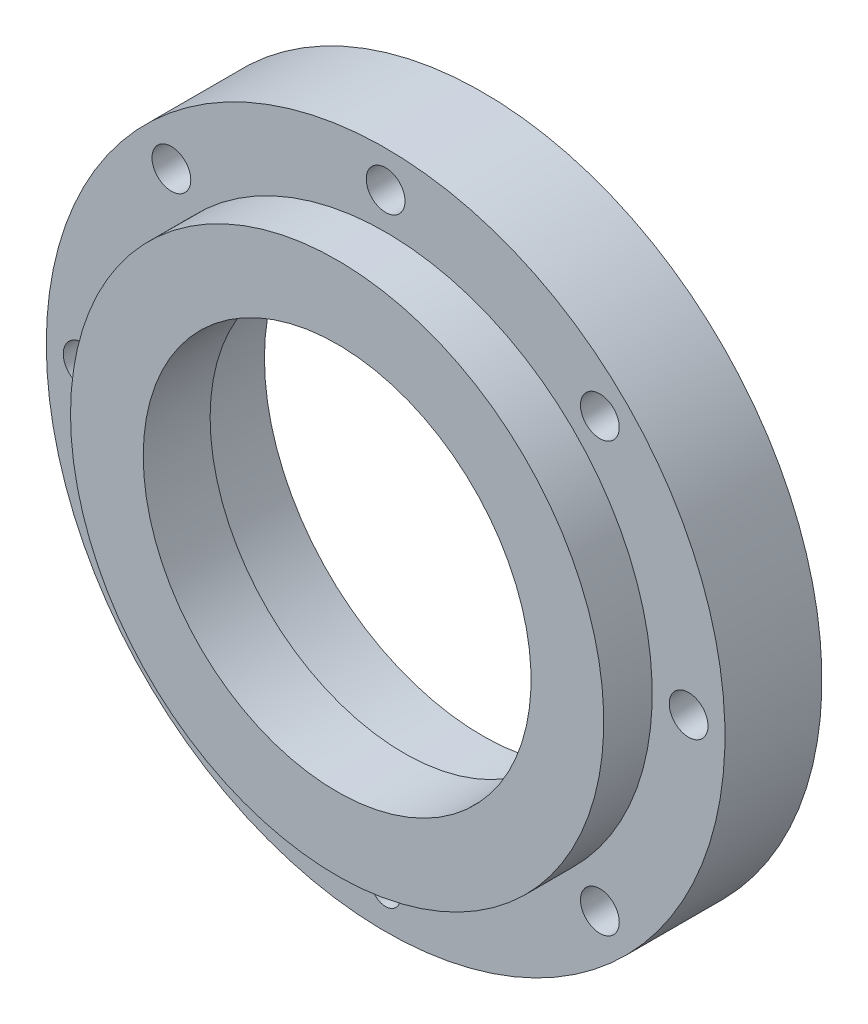
ISO-10303-21;
HEADER;
FILE_DESCRIPTION(('STEP AP214'),'2;1');
FILE_NAME('part.step','',(''),(''),'','','');
FILE_SCHEMA(('AUTOMOTIVE_DESIGN { 1 0 10303 214 1 1 1 1 }'));
ENDSEC;
DATA;
#1=APPLICATION_CONTEXT('core data for automotive mechanical design processes');
#2=APPLICATION_PROTOCOL_DEFINITION('international standard','automotive_design',2000,#1);
#3=PRODUCT_CONTEXT('',#1,'mechanical');
#4=PRODUCT('Part','Part','',(#3));
#5=PRODUCT_RELATED_PRODUCT_CATEGORY('part','',(#4));
#6=PRODUCT_DEFINITION_FORMATION('','',#4);
#7=PRODUCT_DEFINITION_CONTEXT('part definition',#1,'design');
#8=PRODUCT_DEFINITION('design','',#6,#7);
#9=PRODUCT_DEFINITION_SHAPE('','',#8);
#10=(LENGTH_UNIT() NAMED_UNIT(*) SI_UNIT(.MILLI.,.METRE.));
#11=(NAMED_UNIT(*) PLANE_ANGLE_UNIT() SI_UNIT($,.RADIAN.));
#12=(NAMED_UNIT(*) SI_UNIT($,.STERADIAN.) SOLID_ANGLE_UNIT());
#13=UNCERTAINTY_MEASURE_WITH_UNIT(LENGTH_MEASURE(1.E-05),#10,'distance_accuracy_value','');
#14=(GEOMETRIC_REPRESENTATION_CONTEXT(3) GLOBAL_UNCERTAINTY_ASSIGNED_CONTEXT((#13)) GLOBAL_UNIT_ASSIGNED_CONTEXT((#10,
#11,#12)) REPRESENTATION_CONTEXT('',''));
#15=CARTESIAN_POINT('',(0.,0.,0.));
#16=DIRECTION('',(0.,0.,1.));
#17=DIRECTION('',(1.,0.,0.));
#18=AXIS2_PLACEMENT_3D('',#15,#16,#17);
#19=CARTESIAN_POINT('',(-45.,0.,-10.2042412100189));
#20=DIRECTION('',(0.,0.,-1.));
#21=DIRECTION('',(-1.,0.,0.));
#22=AXIS2_PLACEMENT_3D('',#19,#20,#21);
#23=PLANE('',#22);
#24=CARTESIAN_POINT('',(44.194173824159,44.1941738241595,-10.2042412100189));
#25=DIRECTION('',(0.,0.,1.));
#26=DIRECTION('',(1.,0.,0.));
#27=AXIS2_PLACEMENT_3D('',#24,#25,#26);
#28=CIRCLE('',#27,4.);
#29=CARTESIAN_POINT('',(48.194173824159,44.1941738241595,-10.2042412100189));
#30=VERTEX_POINT('',#29);
#31=EDGE_CURVE('E139',#30,#30,#28,.T.);
#32=ORIENTED_EDGE('',*,*,#31,.T.);
#33=EDGE_LOOP('',(#32));
#34=FACE_BOUND('',#33,.T.);
#35=CARTESIAN_POINT('',(62.5,0.,-10.2042412100189));
#36=DIRECTION('',(0.,0.,1.));
#37=DIRECTION('',(1.,0.,0.));
#38=AXIS2_PLACEMENT_3D('',#35,#36,#37);
#39=CIRCLE('',#38,3.99999999999999);
#40=CARTESIAN_POINT('',(66.5,0.,-10.2042412100189));
#41=VERTEX_POINT('',#40);
#42=EDGE_CURVE('E131',#41,#41,#39,.T.);
#43=ORIENTED_EDGE('',*,*,#42,.T.);
#44=EDGE_LOOP('',(#43));
#45=FACE_BOUND('',#44,.T.);
#46=CARTESIAN_POINT('',(0.,0.,-10.2042412100189));
#47=DIRECTION('',(0.,0.,-1.));
#48=DIRECTION('',(-1.,0.,0.));
#49=AXIS2_PLACEMENT_3D('',#46,#47,#48);
#50=CIRCLE('',#49,45.);
#51=CARTESIAN_POINT('',(-45.,0.,-10.2042412100189));
#52=VERTEX_POINT('',#51);
#53=EDGE_CURVE('E61',#52,#52,#50,.T.);
#54=ORIENTED_EDGE('',*,*,#53,.F.);
#55=EDGE_LOOP('',(#54));
#56=FACE_BOUND('',#55,.T.);
#57=CARTESIAN_POINT('',(0.,0.,-10.2042412100189));
#58=DIRECTION('',(0.,0.,-1.));
#59=DIRECTION('',(-1.,0.,0.));
#60=AXIS2_PLACEMENT_3D('',#57,#58,#59);
#61=CIRCLE('',#60,70.);
#62=CARTESIAN_POINT('',(-70.,0.,-10.2042412100189));
#63=VERTEX_POINT('',#62);
#64=EDGE_CURVE('E67',#63,#63,#61,.T.);
#65=ORIENTED_EDGE('',*,*,#64,.T.);
#66=EDGE_LOOP('',(#65));
#67=FACE_BOUND('',#66,.T.);
#68=CARTESIAN_POINT('',(-44.194173824159,44.1941738241595,-10.2042412100189));
#69=DIRECTION('',(0.,0.,1.));
#70=DIRECTION('',(1.,0.,0.));
#71=AXIS2_PLACEMENT_3D('',#68,#69,#70);
#72=CIRCLE('',#71,4.);
#73=CARTESIAN_POINT('',(-40.194173824159,44.1941738241595,-10.2042412100189));
#74=VERTEX_POINT('',#73);
#75=EDGE_CURVE('E96',#74,#74,#72,.T.);
#76=ORIENTED_EDGE('',*,*,#75,.T.);
#77=EDGE_LOOP('',(#76));
#78=FACE_BOUND('',#77,.T.);
#79=CARTESIAN_POINT('',(-62.5,0.,-10.2042412100189));
#80=DIRECTION('',(0.,0.,1.));
#81=DIRECTION('',(1.,0.,0.));
#82=AXIS2_PLACEMENT_3D('',#79,#80,#81);
#83=CIRCLE('',#82,4.);
#84=CARTESIAN_POINT('',(-58.5,0.,-10.2042412100189));
#85=VERTEX_POINT('',#84);
#86=EDGE_CURVE('E107',#85,#85,#83,.T.);
#87=ORIENTED_EDGE('',*,*,#86,.T.);
#88=EDGE_LOOP('',(#87));
#89=FACE_BOUND('',#88,.T.);
#90=CARTESIAN_POINT('',(-44.1941738241592,-44.1941738241592,-10.2042412100189));
#91=DIRECTION('',(0.,0.,1.));
#92=DIRECTION('',(1.,0.,0.));
#93=AXIS2_PLACEMENT_3D('',#90,#91,#92);
#94=CIRCLE('',#93,4.);
#95=CARTESIAN_POINT('',(-40.1941738241592,-44.1941738241592,-10.2042412100189));
#96=VERTEX_POINT('',#95);
#97=EDGE_CURVE('E115',#96,#96,#94,.T.);
#98=ORIENTED_EDGE('',*,*,#97,.T.);
#99=EDGE_LOOP('',(#98));
#100=FACE_BOUND('',#99,.T.);
#101=CARTESIAN_POINT('',(44.1941738241593,-44.1941738241591,-10.2042412100189));
#102=DIRECTION('',(0.,0.,1.));
#103=DIRECTION('',(1.,0.,0.));
#104=AXIS2_PLACEMENT_3D('',#101,#102,#103);
#105=CIRCLE('',#104,4.);
#106=CARTESIAN_POINT('',(48.1941738241593,-44.1941738241591,-10.2042412100189));
#107=VERTEX_POINT('',#106);
#108=EDGE_CURVE('E123',#107,#107,#105,.T.);
#109=ORIENTED_EDGE('',*,*,#108,.T.);
#110=EDGE_LOOP('',(#109));
#111=FACE_BOUND('',#110,.T.);
#112=ADVANCED_FACE('F43',(#34,#45,#56,#67,#78,#89,#100,#111),#23,.T.);
#113=CARTESIAN_POINT('',(-55.,0.,19.7957587899811));
#114=DIRECTION('',(0.,0.,1.));
#115=DIRECTION('',(1.,0.,0.));
#116=AXIS2_PLACEMENT_3D('',#113,#114,#115);
#117=PLANE('',#116);
#118=CARTESIAN_POINT('',(0.,0.,19.7957587899811));
#119=DIRECTION('',(0.,0.,-1.));
#120=DIRECTION('',(-1.,0.,0.));
#121=AXIS2_PLACEMENT_3D('',#118,#119,#120);
#122=CIRCLE('',#121,40.);
#123=CARTESIAN_POINT('',(-40.,0.,19.7957587899811));
#124=VERTEX_POINT('',#123);
#125=EDGE_CURVE('E10',#124,#124,#122,.T.);
#126=ORIENTED_EDGE('',*,*,#125,.T.);
#127=EDGE_LOOP('',(#126));
#128=FACE_BOUND('',#127,.T.);
#129=CARTESIAN_POINT('',(0.,0.,19.7957587899811));
#130=DIRECTION('',(0.,0.,-1.));
#131=DIRECTION('',(-1.,0.,0.));
#132=AXIS2_PLACEMENT_3D('',#129,#130,#131);
#133=CIRCLE('',#132,55.);
#134=CARTESIAN_POINT('',(-55.,0.,19.7957587899811));
#135=VERTEX_POINT('',#134);
#136=EDGE_CURVE('E79',#135,#135,#133,.T.);
#137=ORIENTED_EDGE('',*,*,#136,.F.);
#138=EDGE_LOOP('',(#137));
#139=FACE_BOUND('',#138,.T.);
#140=ADVANCED_FACE('F45',(#128,#139),#117,.T.);
#141=CARTESIAN_POINT('',(0.,0.,-52.7073742680634));
#142=DIRECTION('',(0.,0.,-1.));
#143=DIRECTION('',(-1.,0.,0.));
#144=AXIS2_PLACEMENT_3D('',#141,#142,#143);
#145=CYLINDRICAL_SURFACE('',#144,40.);
#146=CARTESIAN_POINT('',(0.,0.,6.00000000000001));
#147=DIRECTION('',(0.,0.,-1.));
#148=DIRECTION('',(-1.,0.,0.));
#149=AXIS2_PLACEMENT_3D('',#146,#147,#148);
#150=CIRCLE('',#149,40.);
#151=CARTESIAN_POINT('',(-40.,0.,6.00000000000001));
#152=VERTEX_POINT('',#151);
#153=EDGE_CURVE('E51',#152,#152,#150,.T.);
#154=ORIENTED_EDGE('',*,*,#153,.T.);
#155=EDGE_LOOP('',(#154));
#156=FACE_BOUND('',#155,.T.);
#157=ORIENTED_EDGE('',*,*,#125,.F.);
#158=EDGE_LOOP('',(#157));
#159=FACE_BOUND('',#158,.T.);
#160=ADVANCED_FACE('F240',(#156,#159),#145,.F.);
#161=CARTESIAN_POINT('',(-40.,0.,6.00000000000001));
#162=DIRECTION('',(0.,0.,-1.));
#163=DIRECTION('',(-1.,0.,0.));
#164=AXIS2_PLACEMENT_3D('',#161,#162,#163);
#165=PLANE('',#164);
#166=CARTESIAN_POINT('',(0.,0.,6.00000000000001));
#167=DIRECTION('',(0.,0.,-1.));
#168=DIRECTION('',(-1.,0.,0.));
#169=AXIS2_PLACEMENT_3D('',#166,#167,#168);
#170=CIRCLE('',#169,45.);
#171=CARTESIAN_POINT('',(-45.,0.,6.00000000000001));
#172=VERTEX_POINT('',#171);
#173=EDGE_CURVE('E56',#172,#172,#170,.T.);
#174=ORIENTED_EDGE('',*,*,#173,.T.);
#175=EDGE_LOOP('',(#174));
#176=FACE_BOUND('',#175,.T.);
#177=ORIENTED_EDGE('',*,*,#153,.F.);
#178=EDGE_LOOP('',(#177));
#179=FACE_BOUND('',#178,.T.);
#180=ADVANCED_FACE('F237',(#176,#179),#165,.T.);
#181=CARTESIAN_POINT('',(0.,0.,-52.7073742680634));
#182=DIRECTION('',(0.,0.,-1.));
#183=DIRECTION('',(-1.,0.,0.));
#184=AXIS2_PLACEMENT_3D('',#181,#182,#183);
#185=CYLINDRICAL_SURFACE('',#184,45.);
#186=ORIENTED_EDGE('',*,*,#53,.T.);
#187=EDGE_LOOP('',(#186));
#188=FACE_BOUND('',#187,.T.);
#189=ORIENTED_EDGE('',*,*,#173,.F.);
#190=EDGE_LOOP('',(#189));
#191=FACE_BOUND('',#190,.T.);
#192=ADVANCED_FACE('F176',(#188,#191),#185,.F.);
#193=CARTESIAN_POINT('',(0.,0.,-52.7073742680634));
#194=DIRECTION('',(0.,0.,-1.));
#195=DIRECTION('',(-1.,0.,0.));
#196=AXIS2_PLACEMENT_3D('',#193,#194,#195);
#197=CYLINDRICAL_SURFACE('',#196,70.);
#198=CARTESIAN_POINT('',(0.,0.,9.79575878998107));
#199=DIRECTION('',(0.,0.,-1.));
#200=DIRECTION('',(-1.,0.,0.));
#201=AXIS2_PLACEMENT_3D('',#198,#199,#200);
#202=CIRCLE('',#201,70.);
#203=CARTESIAN_POINT('',(-70.,0.,9.79575878998107));
#204=VERTEX_POINT('',#203);
#205=EDGE_CURVE('E71',#204,#204,#202,.T.);
#206=ORIENTED_EDGE('',*,*,#205,.T.);
#207=EDGE_LOOP('',(#206));
#208=FACE_BOUND('',#207,.T.);
#209=ORIENTED_EDGE('',*,*,#64,.F.);
#210=EDGE_LOOP('',(#209));
#211=FACE_BOUND('',#210,.T.);
#212=ADVANCED_FACE('F154',(#208,#211),#197,.T.);
#213=CARTESIAN_POINT('',(-55.,0.,9.79575878998107));
#214=DIRECTION('',(0.,0.,1.));
#215=DIRECTION('',(1.,0.,0.));
#216=AXIS2_PLACEMENT_3D('',#213,#214,#215);
#217=PLANE('',#216);
#218=CARTESIAN_POINT('',(44.194173824159,44.1941738241595,9.79575878998107));
#219=DIRECTION('',(0.,0.,1.));
#220=DIRECTION('',(1.,0.,0.));
#221=AXIS2_PLACEMENT_3D('',#218,#219,#220);
#222=CIRCLE('',#221,3.99999999999999);
#223=CARTESIAN_POINT('',(48.194173824159,44.1941738241595,9.79575878998107));
#224=VERTEX_POINT('',#223);
#225=EDGE_CURVE('E143',#224,#224,#222,.T.);
#226=ORIENTED_EDGE('',*,*,#225,.F.);
#227=EDGE_LOOP('',(#226));
#228=FACE_BOUND('',#227,.T.);
#229=CARTESIAN_POINT('',(62.5,0.,9.79575878998107));
#230=DIRECTION('',(0.,0.,1.));
#231=DIRECTION('',(1.,0.,0.));
#232=AXIS2_PLACEMENT_3D('',#229,#230,#231);
#233=CIRCLE('',#232,3.99999999999999);
#234=CARTESIAN_POINT('',(66.5,0.,9.79575878998107));
#235=VERTEX_POINT('',#234);
#236=EDGE_CURVE('E135',#235,#235,#233,.T.);
#237=ORIENTED_EDGE('',*,*,#236,.F.);
#238=EDGE_LOOP('',(#237));
#239=FACE_BOUND('',#238,.T.);
#240=CARTESIAN_POINT('',(44.1941738241593,-44.1941738241591,9.79575878998107));
#241=DIRECTION('',(0.,0.,1.));
#242=DIRECTION('',(1.,0.,0.));
#243=AXIS2_PLACEMENT_3D('',#240,#241,#242);
#244=CIRCLE('',#243,3.99999999999999);
#245=CARTESIAN_POINT('',(48.1941738241593,-44.1941738241591,9.79575878998107));
#246=VERTEX_POINT('',#245);
#247=EDGE_CURVE('E127',#246,#246,#244,.T.);
#248=ORIENTED_EDGE('',*,*,#247,.F.);
#249=EDGE_LOOP('',(#248));
#250=FACE_BOUND('',#249,.T.);
#251=CARTESIAN_POINT('',(-44.1941738241592,-44.1941738241592,9.79575878998107));
#252=DIRECTION('',(0.,0.,1.));
#253=DIRECTION('',(1.,0.,0.));
#254=AXIS2_PLACEMENT_3D('',#251,#252,#253);
#255=CIRCLE('',#254,3.99999999999999);
#256=CARTESIAN_POINT('',(-40.1941738241592,-44.1941738241592,9.79575878998107));
#257=VERTEX_POINT('',#256);
#258=EDGE_CURVE('E119',#257,#257,#255,.T.);
#259=ORIENTED_EDGE('',*,*,#258,.F.);
#260=EDGE_LOOP('',(#259));
#261=FACE_BOUND('',#260,.T.);
#262=CARTESIAN_POINT('',(-62.5,0.,9.79575878998107));
#263=DIRECTION('',(0.,0.,1.));
#264=DIRECTION('',(1.,0.,0.));
#265=AXIS2_PLACEMENT_3D('',#262,#263,#264);
#266=CIRCLE('',#265,3.99999999999999);
#267=CARTESIAN_POINT('',(-58.5,0.,9.79575878998107));
#268=VERTEX_POINT('',#267);
#269=EDGE_CURVE('E111',#268,#268,#266,.T.);
#270=ORIENTED_EDGE('',*,*,#269,.F.);
#271=EDGE_LOOP('',(#270));
#272=FACE_BOUND('',#271,.T.);
#273=CARTESIAN_POINT('',(-44.194173824159,44.1941738241595,9.79575878998107));
#274=DIRECTION('',(0.,0.,1.));
#275=DIRECTION('',(1.,0.,0.));
#276=AXIS2_PLACEMENT_3D('',#273,#274,#275);
#277=CIRCLE('',#276,3.99999999999999);
#278=CARTESIAN_POINT('',(-40.194173824159,44.1941738241595,9.79575878998107));
#279=VERTEX_POINT('',#278);
#280=EDGE_CURVE('E103',#279,#279,#277,.T.);
#281=ORIENTED_EDGE('',*,*,#280,.F.);
#282=EDGE_LOOP('',(#281));
#283=FACE_BOUND('',#282,.T.);
#284=CARTESIAN_POINT('',(0.,62.5,9.79575878998107));
#285=DIRECTION('',(0.,0.,1.));
#286=DIRECTION('',(1.,0.,0.));
#287=AXIS2_PLACEMENT_3D('',#284,#285,#286);
#288=CIRCLE('',#287,4.);
#289=CARTESIAN_POINT('',(4.,62.5,9.79575878998107));
#290=VERTEX_POINT('',#289);
#291=EDGE_CURVE('E92',#290,#290,#288,.T.);
#292=ORIENTED_EDGE('',*,*,#291,.F.);
#293=EDGE_LOOP('',(#292));
#294=FACE_BOUND('',#293,.T.);
#295=CARTESIAN_POINT('',(0.,-62.5,9.79575878998107));
#296=DIRECTION('',(0.,0.,1.));
#297=DIRECTION('',(1.,0.,0.));
#298=AXIS2_PLACEMENT_3D('',#295,#296,#297);
#299=CIRCLE('',#298,3.);
#300=CARTESIAN_POINT('',(3.,-62.5,9.79575878998107));
#301=VERTEX_POINT('',#300);
#302=EDGE_CURVE('E84',#301,#301,#299,.T.);
#303=ORIENTED_EDGE('',*,*,#302,.F.);
#304=EDGE_LOOP('',(#303));
#305=FACE_BOUND('',#304,.T.);
#306=CARTESIAN_POINT('',(0.,0.,9.79575878998107));
#307=DIRECTION('',(0.,0.,-1.));
#308=DIRECTION('',(-1.,0.,0.));
#309=AXIS2_PLACEMENT_3D('',#306,#307,#308);
#310=CIRCLE('',#309,55.);
#311=CARTESIAN_POINT('',(-55.,0.,9.79575878998107));
#312=VERTEX_POINT('',#311);
#313=EDGE_CURVE('E75',#312,#312,#310,.T.);
#314=ORIENTED_EDGE('',*,*,#313,.T.);
#315=EDGE_LOOP('',(#314));
#316=FACE_BOUND('',#315,.T.);
#317=ORIENTED_EDGE('',*,*,#205,.F.);
#318=EDGE_LOOP('',(#317));
#319=FACE_BOUND('',#318,.T.);
#320=ADVANCED_FACE('F150',(#228,#239,#250,#261,#272,#283,#294,#305,#316,#319),#217,.T.);
#321=CARTESIAN_POINT('',(0.,0.,-52.7073742680634));
#322=DIRECTION('',(0.,0.,-1.));
#323=DIRECTION('',(-1.,0.,0.));
#324=AXIS2_PLACEMENT_3D('',#321,#322,#323);
#325=CYLINDRICAL_SURFACE('',#324,55.);
#326=ORIENTED_EDGE('',*,*,#136,.T.);
#327=EDGE_LOOP('',(#326));
#328=FACE_BOUND('',#327,.T.);
#329=ORIENTED_EDGE('',*,*,#313,.F.);
#330=EDGE_LOOP('',(#329));
#331=FACE_BOUND('',#330,.T.);
#332=ADVANCED_FACE('F153',(#328,#331),#325,.T.);
#333=CARTESIAN_POINT('',(0.,-62.5,0.795758789981069));
#334=DIRECTION('',(0.,0.,1.));
#335=DIRECTION('',(1.,0.,0.));
#336=AXIS2_PLACEMENT_3D('',#333,#334,#335);
#337=CYLINDRICAL_SURFACE('',#336,3.);
#338=CARTESIAN_POINT('',(0.,-62.5,0.795758789981069));
#339=DIRECTION('',(0.,0.,1.));
#340=DIRECTION('',(1.,0.,0.));
#341=AXIS2_PLACEMENT_3D('',#338,#339,#340);
#342=CIRCLE('',#341,3.);
#343=CARTESIAN_POINT('',(3.,-62.5,0.795758789981069));
#344=VERTEX_POINT('',#343);
#345=EDGE_CURVE('E83',#344,#344,#342,.T.);
#346=ORIENTED_EDGE('',*,*,#345,.F.);
#347=EDGE_LOOP('',(#346));
#348=FACE_BOUND('',#347,.T.);
#349=ORIENTED_EDGE('',*,*,#302,.T.);
#350=EDGE_LOOP('',(#349));
#351=FACE_BOUND('',#350,.T.);
#352=ADVANCED_FACE('F227',(#348,#351),#337,.F.);
#353=CARTESIAN_POINT('',(0.,-62.5,0.795758789981069));
#354=DIRECTION('',(0.,0.,1.));
#355=DIRECTION('',(1.,0.,0.));
#356=AXIS2_PLACEMENT_3D('',#353,#354,#355);
#357=PLANE('',#356);
#358=ORIENTED_EDGE('',*,*,#345,.T.);
#359=EDGE_LOOP('',(#358));
#360=FACE_BOUND('',#359,.T.);
#361=ADVANCED_FACE('F223',(#360),#357,.T.);
#362=CARTESIAN_POINT('',(0.,62.5,-0.204241210018932));
#363=DIRECTION('',(0.,0.,1.));
#364=DIRECTION('',(1.,0.,0.));
#365=AXIS2_PLACEMENT_3D('',#362,#363,#364);
#366=CYLINDRICAL_SURFACE('',#365,4.);
#367=CARTESIAN_POINT('',(0.,62.5,-0.204241210018932));
#368=DIRECTION('',(0.,0.,1.));
#369=DIRECTION('',(1.,0.,0.));
#370=AXIS2_PLACEMENT_3D('',#367,#368,#369);
#371=CIRCLE('',#370,4.);
#372=CARTESIAN_POINT('',(4.,62.5,-0.204241210018932));
#373=VERTEX_POINT('',#372);
#374=EDGE_CURVE('E88',#373,#373,#371,.T.);
#375=ORIENTED_EDGE('',*,*,#374,.F.);
#376=EDGE_LOOP('',(#375));
#377=FACE_BOUND('',#376,.T.);
#378=ORIENTED_EDGE('',*,*,#291,.T.);
#379=EDGE_LOOP('',(#378));
#380=FACE_BOUND('',#379,.T.);
#381=ADVANCED_FACE('F219',(#377,#380),#366,.F.);
#382=CARTESIAN_POINT('',(0.,62.5,-0.204241210018932));
#383=DIRECTION('',(0.,0.,1.));
#384=DIRECTION('',(1.,0.,0.));
#385=AXIS2_PLACEMENT_3D('',#382,#383,#384);
#386=PLANE('',#385);
#387=ORIENTED_EDGE('',*,*,#374,.T.);
#388=EDGE_LOOP('',(#387));
#389=FACE_BOUND('',#388,.T.);
#390=ADVANCED_FACE('F215',(#389),#386,.T.);
#391=CARTESIAN_POINT('',(-44.194173824159,44.1941738241595,9.79575878998107));
#392=DIRECTION('',(0.,0.,1.));
#393=DIRECTION('',(1.,0.,0.));
#394=AXIS2_PLACEMENT_3D('',#391,#392,#393);
#395=CYLINDRICAL_SURFACE('',#394,3.99999999999999);
#396=ORIENTED_EDGE('',*,*,#75,.F.);
#397=EDGE_LOOP('',(#396));
#398=FACE_BOUND('',#397,.T.);
#399=ORIENTED_EDGE('',*,*,#280,.T.);
#400=EDGE_LOOP('',(#399));
#401=FACE_BOUND('',#400,.T.);
#402=ADVANCED_FACE('F211',(#398,#401),#395,.F.);
#403=CARTESIAN_POINT('',(-62.5,0.,9.79575878998107));
#404=DIRECTION('',(0.,0.,1.));
#405=DIRECTION('',(1.,0.,0.));
#406=AXIS2_PLACEMENT_3D('',#403,#404,#405);
#407=CYLINDRICAL_SURFACE('',#406,3.99999999999999);
#408=ORIENTED_EDGE('',*,*,#86,.F.);
#409=EDGE_LOOP('',(#408));
#410=FACE_BOUND('',#409,.T.);
#411=ORIENTED_EDGE('',*,*,#269,.T.);
#412=EDGE_LOOP('',(#411));
#413=FACE_BOUND('',#412,.T.);
#414=ADVANCED_FACE('F204',(#410,#413),#407,.F.);
#415=CARTESIAN_POINT('',(-44.1941738241592,-44.1941738241592,9.79575878998107));
#416=DIRECTION('',(0.,0.,1.));
#417=DIRECTION('',(1.,0.,0.));
#418=AXIS2_PLACEMENT_3D('',#415,#416,#417);
#419=CYLINDRICAL_SURFACE('',#418,3.99999999999999);
#420=ORIENTED_EDGE('',*,*,#97,.F.);
#421=EDGE_LOOP('',(#420));
#422=FACE_BOUND('',#421,.T.);
#423=ORIENTED_EDGE('',*,*,#258,.T.);
#424=EDGE_LOOP('',(#423));
#425=FACE_BOUND('',#424,.T.);
#426=ADVANCED_FACE('F196',(#422,#425),#419,.F.);
#427=CARTESIAN_POINT('',(44.1941738241593,-44.1941738241591,9.79575878998107));
#428=DIRECTION('',(0.,0.,1.));
#429=DIRECTION('',(1.,0.,0.));
#430=AXIS2_PLACEMENT_3D('',#427,#428,#429);
#431=CYLINDRICAL_SURFACE('',#430,3.99999999999999);
#432=ORIENTED_EDGE('',*,*,#108,.F.);
#433=EDGE_LOOP('',(#432));
#434=FACE_BOUND('',#433,.T.);
#435=ORIENTED_EDGE('',*,*,#247,.T.);
#436=EDGE_LOOP('',(#435));
#437=FACE_BOUND('',#436,.T.);
#438=ADVANCED_FACE('F192',(#434,#437),#431,.F.);
#439=CARTESIAN_POINT('',(62.5,0.,9.79575878998107));
#440=DIRECTION('',(0.,0.,1.));
#441=DIRECTION('',(1.,0.,0.));
#442=AXIS2_PLACEMENT_3D('',#439,#440,#441);
#443=CYLINDRICAL_SURFACE('',#442,3.99999999999999);
#444=ORIENTED_EDGE('',*,*,#42,.F.);
#445=EDGE_LOOP('',(#444));
#446=FACE_BOUND('',#445,.T.);
#447=ORIENTED_EDGE('',*,*,#236,.T.);
#448=EDGE_LOOP('',(#447));
#449=FACE_BOUND('',#448,.T.);
#450=ADVANCED_FACE('F195',(#446,#449),#443,.F.);
#451=CARTESIAN_POINT('',(44.194173824159,44.1941738241595,9.79575878998107));
#452=DIRECTION('',(0.,0.,1.));
#453=DIRECTION('',(1.,0.,0.));
#454=AXIS2_PLACEMENT_3D('',#451,#452,#453);
#455=CYLINDRICAL_SURFACE('',#454,3.99999999999999);
#456=ORIENTED_EDGE('',*,*,#31,.F.);
#457=EDGE_LOOP('',(#456));
#458=FACE_BOUND('',#457,.T.);
#459=ORIENTED_EDGE('',*,*,#225,.T.);
#460=EDGE_LOOP('',(#459));
#461=FACE_BOUND('',#460,.T.);
#462=ADVANCED_FACE('F148',(#458,#461),#455,.F.);
#463=CLOSED_SHELL('',(#112,#140,#160,#180,#192,#212,#320,#332,#352,#361,#381,#390,#402,#414,
#426,#438,#450,#462));
#464=MANIFOLD_SOLID_BREP('B2',#463);
#465=ADVANCED_BREP_SHAPE_REPRESENTATION('',(#18,#464),#14);
#466=SHAPE_DEFINITION_REPRESENTATION(#9,#465);
ENDSEC;
END-ISO-10303-21;
